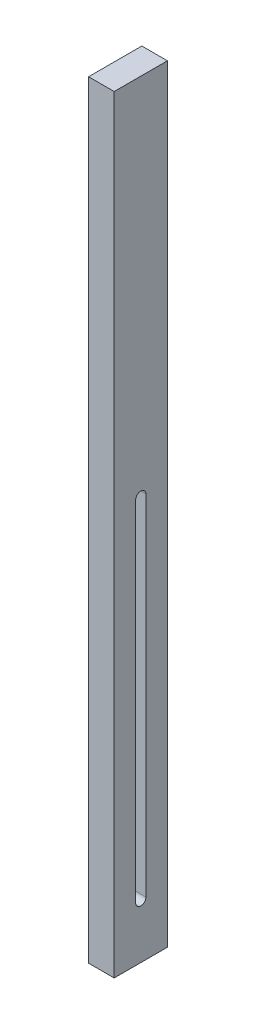
ISO-10303-21;
HEADER;
FILE_DESCRIPTION(('STEP AP214'),'2;1');
FILE_NAME('part.step','',(''),(''),'','','');
FILE_SCHEMA(('AUTOMOTIVE_DESIGN { 1 0 10303 214 1 1 1 1 }'));
ENDSEC;
DATA;
#1=APPLICATION_CONTEXT('core data for automotive mechanical design processes');
#2=APPLICATION_PROTOCOL_DEFINITION('international standard','automotive_design',2000,#1);
#3=PRODUCT_CONTEXT('',#1,'mechanical');
#4=PRODUCT('Part','Part','',(#3));
#5=PRODUCT_RELATED_PRODUCT_CATEGORY('part','',(#4));
#6=PRODUCT_DEFINITION_FORMATION('','',#4);
#7=PRODUCT_DEFINITION_CONTEXT('part definition',#1,'design');
#8=PRODUCT_DEFINITION('design','',#6,#7);
#9=PRODUCT_DEFINITION_SHAPE('','',#8);
#10=(LENGTH_UNIT() NAMED_UNIT(*) SI_UNIT(.MILLI.,.METRE.));
#11=(NAMED_UNIT(*) PLANE_ANGLE_UNIT() SI_UNIT($,.RADIAN.));
#12=(NAMED_UNIT(*) SI_UNIT($,.STERADIAN.) SOLID_ANGLE_UNIT());
#13=UNCERTAINTY_MEASURE_WITH_UNIT(LENGTH_MEASURE(1.E-05),#10,'distance_accuracy_value','');
#14=(GEOMETRIC_REPRESENTATION_CONTEXT(3) GLOBAL_UNCERTAINTY_ASSIGNED_CONTEXT((#13)) GLOBAL_UNIT_ASSIGNED_CONTEXT((#10,
#11,#12)) REPRESENTATION_CONTEXT('',''));
#15=CARTESIAN_POINT('',(0.,0.,0.));
#16=DIRECTION('',(0.,0.,1.));
#17=DIRECTION('',(1.,0.,0.));
#18=AXIS2_PLACEMENT_3D('',#15,#16,#17);
#19=CARTESIAN_POINT('',(-101.237623762376,750.,-21.9059405940594));
#20=DIRECTION('',(1.,0.,0.));
#21=DIRECTION('',(0.,0.,-1.));
#22=AXIS2_PLACEMENT_3D('',#19,#20,#21);
#23=PLANE('',#22);
#24=DIRECTION('',(0.,0.,1.));
#25=VECTOR('',#24,1.);
#26=CARTESIAN_POINT('',(-101.237623762376,0.,-21.9059405940594));
#27=LINE('',#26,#25);
#28=CARTESIAN_POINT('',(-101.237623762376,0.,-21.9059405940594));
#29=VERTEX_POINT('',#28);
#30=CARTESIAN_POINT('',(-101.237623762376,0.,30.0940594059406));
#31=VERTEX_POINT('',#30);
#32=EDGE_CURVE('E130',#29,#31,#27,.T.);
#33=ORIENTED_EDGE('',*,*,#32,.T.);
#34=DIRECTION('',(0.,-1.,0.));
#35=VECTOR('',#34,1.);
#36=CARTESIAN_POINT('',(-101.237623762376,750.,30.0940594059406));
#37=LINE('',#36,#35);
#38=CARTESIAN_POINT('',(-101.237623762376,750.,30.0940594059406));
#39=VERTEX_POINT('',#38);
#40=EDGE_CURVE('E159',#39,#31,#37,.T.);
#41=ORIENTED_EDGE('',*,*,#40,.F.);
#42=DIRECTION('',(0.,0.,1.));
#43=VECTOR('',#42,1.);
#44=CARTESIAN_POINT('',(-101.237623762376,750.,-21.9059405940594));
#45=LINE('',#44,#43);
#46=CARTESIAN_POINT('',(-101.237623762376,750.,-21.9059405940594));
#47=VERTEX_POINT('',#46);
#48=EDGE_CURVE('E133',#47,#39,#45,.T.);
#49=ORIENTED_EDGE('',*,*,#48,.F.);
#50=DIRECTION('',(0.,-1.,0.));
#51=VECTOR('',#50,1.);
#52=CARTESIAN_POINT('',(-101.237623762376,750.,-21.9059405940594));
#53=LINE('',#52,#51);
#54=EDGE_CURVE('E143',#47,#29,#53,.T.);
#55=ORIENTED_EDGE('',*,*,#54,.T.);
#56=EDGE_LOOP('',(#33,#41,#49,#55));
#57=FACE_BOUND('',#56,.T.);
#58=DIRECTION('',(0.,-1.,0.));
#59=VECTOR('',#58,1.);
#60=CARTESIAN_POINT('',(-101.237623762376,0.,9.09405940594056));
#61=LINE('',#60,#59);
#62=CARTESIAN_POINT('',(-101.237623762376,394.,9.09405940594062));
#63=VERTEX_POINT('',#62);
#64=CARTESIAN_POINT('',(-101.237623762376,53.,9.09405940594057));
#65=VERTEX_POINT('',#64);
#66=EDGE_CURVE('E57',#63,#65,#61,.T.);
#67=ORIENTED_EDGE('',*,*,#66,.T.);
#68=CARTESIAN_POINT('',(-101.237623762376,53.,4.09405940594061));
#69=DIRECTION('',(-1.,0.,0.));
#70=DIRECTION('',(0.,0.,1.));
#71=AXIS2_PLACEMENT_3D('',#68,#69,#70);
#72=CIRCLE('',#71,4.99999999999996);
#73=CARTESIAN_POINT('',(-101.237623762376,53.,-0.905940594059353));
#74=VERTEX_POINT('',#73);
#75=EDGE_CURVE('E123',#74,#65,#72,.T.);
#76=ORIENTED_EDGE('',*,*,#75,.F.);
#77=DIRECTION('',(0.,-1.,0.));
#78=VECTOR('',#77,1.);
#79=CARTESIAN_POINT('',(-101.237623762376,0.,-0.905940594059345));
#80=LINE('',#79,#78);
#81=CARTESIAN_POINT('',(-101.237623762376,394.,-0.905940594059405));
#82=VERTEX_POINT('',#81);
#83=EDGE_CURVE('E109',#82,#74,#80,.T.);
#84=ORIENTED_EDGE('',*,*,#83,.F.);
#85=CARTESIAN_POINT('',(-101.237623762376,394.,4.09405940594061));
#86=DIRECTION('',(-1.,0.,0.));
#87=DIRECTION('',(0.,0.,1.));
#88=AXIS2_PLACEMENT_3D('',#85,#86,#87);
#89=CIRCLE('',#88,5.00000000000001);
#90=EDGE_CURVE('E118',#63,#82,#89,.T.);
#91=ORIENTED_EDGE('',*,*,#90,.F.);
#92=EDGE_LOOP('',(#67,#76,#84,#91));
#93=FACE_BOUND('',#92,.T.);
#94=ADVANCED_FACE('F43',(#57,#93),#23,.F.);
#95=CARTESIAN_POINT('',(-76.2376237623762,750.,-21.9059405940594));
#96=DIRECTION('',(-1.,0.,0.));
#97=DIRECTION('',(0.,0.,1.));
#98=AXIS2_PLACEMENT_3D('',#95,#96,#97);
#99=PLANE('',#98);
#100=DIRECTION('',(0.,0.,-1.));
#101=VECTOR('',#100,1.);
#102=CARTESIAN_POINT('',(-76.2376237623762,0.,-21.9059405940594));
#103=LINE('',#102,#101);
#104=CARTESIAN_POINT('',(-76.2376237623762,0.,30.0940594059406));
#105=VERTEX_POINT('',#104);
#106=CARTESIAN_POINT('',(-76.2376237623762,0.,-21.9059405940594));
#107=VERTEX_POINT('',#106);
#108=EDGE_CURVE('E148',#105,#107,#103,.T.);
#109=ORIENTED_EDGE('',*,*,#108,.T.);
#110=DIRECTION('',(0.,-1.,0.));
#111=VECTOR('',#110,1.);
#112=CARTESIAN_POINT('',(-76.2376237623762,750.,-21.9059405940594));
#113=LINE('',#112,#111);
#114=CARTESIAN_POINT('',(-76.2376237623762,750.,-21.9059405940594));
#115=VERTEX_POINT('',#114);
#116=EDGE_CURVE('E153',#115,#107,#113,.T.);
#117=ORIENTED_EDGE('',*,*,#116,.F.);
#118=DIRECTION('',(0.,0.,-1.));
#119=VECTOR('',#118,1.);
#120=CARTESIAN_POINT('',(-76.2376237623762,750.,-21.9059405940594));
#121=LINE('',#120,#119);
#122=CARTESIAN_POINT('',(-76.2376237623762,750.,30.0940594059406));
#123=VERTEX_POINT('',#122);
#124=EDGE_CURVE('E139',#123,#115,#121,.T.);
#125=ORIENTED_EDGE('',*,*,#124,.F.);
#126=DIRECTION('',(0.,-1.,0.));
#127=VECTOR('',#126,1.);
#128=CARTESIAN_POINT('',(-76.2376237623762,750.,30.0940594059406));
#129=LINE('',#128,#127);
#130=EDGE_CURVE('E156',#123,#105,#129,.T.);
#131=ORIENTED_EDGE('',*,*,#130,.T.);
#132=EDGE_LOOP('',(#109,#117,#125,#131));
#133=FACE_BOUND('',#132,.T.);
#134=DIRECTION('',(0.,-1.,0.));
#135=VECTOR('',#134,1.);
#136=CARTESIAN_POINT('',(-76.2376237623762,750.,9.09405940594067));
#137=LINE('',#136,#135);
#138=CARTESIAN_POINT('',(-76.2376237623762,394.,9.09405940594062));
#139=VERTEX_POINT('',#138);
#140=CARTESIAN_POINT('',(-76.2376237623762,53.,9.09405940594057));
#141=VERTEX_POINT('',#140);
#142=EDGE_CURVE('E11',#139,#141,#137,.T.);
#143=ORIENTED_EDGE('',*,*,#142,.F.);
#144=CARTESIAN_POINT('',(-76.2376237623762,394.,4.09405940594061));
#145=DIRECTION('',(-1.,0.,0.));
#146=DIRECTION('',(0.,0.,1.));
#147=AXIS2_PLACEMENT_3D('',#144,#145,#146);
#148=CIRCLE('',#147,5.00000000000001);
#149=CARTESIAN_POINT('',(-76.2376237623762,394.,-0.905940594059405));
#150=VERTEX_POINT('',#149);
#151=EDGE_CURVE('E162',#139,#150,#148,.T.);
#152=ORIENTED_EDGE('',*,*,#151,.T.);
#153=DIRECTION('',(0.,-1.,0.));
#154=VECTOR('',#153,1.);
#155=CARTESIAN_POINT('',(-76.2376237623762,750.,-0.905940594059459));
#156=LINE('',#155,#154);
#157=CARTESIAN_POINT('',(-76.2376237623762,53.,-0.905940594059353));
#158=VERTEX_POINT('',#157);
#159=EDGE_CURVE('E112',#150,#158,#156,.T.);
#160=ORIENTED_EDGE('',*,*,#159,.T.);
#161=CARTESIAN_POINT('',(-76.2376237623762,53.,4.09405940594061));
#162=DIRECTION('',(-1.,0.,0.));
#163=DIRECTION('',(0.,0.,1.));
#164=AXIS2_PLACEMENT_3D('',#161,#162,#163);
#165=CIRCLE('',#164,4.99999999999996);
#166=EDGE_CURVE('E50',#158,#141,#165,.T.);
#167=ORIENTED_EDGE('',*,*,#166,.T.);
#168=EDGE_LOOP('',(#143,#152,#160,#167));
#169=FACE_BOUND('',#168,.T.);
#170=ADVANCED_FACE('F167',(#133,#169),#99,.F.);
#171=CARTESIAN_POINT('',(-101.237623762376,750.,30.0940594059406));
#172=DIRECTION('',(0.,0.,-1.));
#173=DIRECTION('',(-1.,0.,0.));
#174=AXIS2_PLACEMENT_3D('',#171,#172,#173);
#175=PLANE('',#174);
#176=DIRECTION('',(1.,0.,0.));
#177=VECTOR('',#176,1.);
#178=CARTESIAN_POINT('',(-101.237623762376,0.,30.0940594059406));
#179=LINE('',#178,#177);
#180=EDGE_CURVE('E146',#31,#105,#179,.T.);
#181=ORIENTED_EDGE('',*,*,#180,.T.);
#182=ORIENTED_EDGE('',*,*,#130,.F.);
#183=DIRECTION('',(1.,0.,0.));
#184=VECTOR('',#183,1.);
#185=CARTESIAN_POINT('',(-101.237623762376,750.,30.0940594059406));
#186=LINE('',#185,#184);
#187=EDGE_CURVE('E136',#39,#123,#186,.T.);
#188=ORIENTED_EDGE('',*,*,#187,.F.);
#189=ORIENTED_EDGE('',*,*,#40,.T.);
#190=EDGE_LOOP('',(#181,#182,#188,#189));
#191=FACE_BOUND('',#190,.T.);
#192=ADVANCED_FACE('F190',(#191),#175,.F.);
#193=CARTESIAN_POINT('',(-101.237623762376,750.,-21.9059405940594));
#194=DIRECTION('',(0.,0.,1.));
#195=DIRECTION('',(1.,0.,0.));
#196=AXIS2_PLACEMENT_3D('',#193,#194,#195);
#197=PLANE('',#196);
#198=DIRECTION('',(-1.,0.,0.));
#199=VECTOR('',#198,1.);
#200=CARTESIAN_POINT('',(-101.237623762376,0.,-21.9059405940594));
#201=LINE('',#200,#199);
#202=EDGE_CURVE('E137',#107,#29,#201,.T.);
#203=ORIENTED_EDGE('',*,*,#202,.T.);
#204=ORIENTED_EDGE('',*,*,#54,.F.);
#205=DIRECTION('',(-1.,0.,0.));
#206=VECTOR('',#205,1.);
#207=CARTESIAN_POINT('',(-101.237623762376,750.,-21.9059405940594));
#208=LINE('',#207,#206);
#209=EDGE_CURVE('E141',#115,#47,#208,.T.);
#210=ORIENTED_EDGE('',*,*,#209,.F.);
#211=ORIENTED_EDGE('',*,*,#116,.T.);
#212=EDGE_LOOP('',(#203,#204,#210,#211));
#213=FACE_BOUND('',#212,.T.);
#214=ADVANCED_FACE('F206',(#213),#197,.F.);
#215=CARTESIAN_POINT('',(0.,750.,0.));
#216=DIRECTION('',(0.,1.,0.));
#217=DIRECTION('',(0.,0.,1.));
#218=AXIS2_PLACEMENT_3D('',#215,#216,#217);
#219=PLANE('',#218);
#220=ORIENTED_EDGE('',*,*,#48,.T.);
#221=ORIENTED_EDGE('',*,*,#187,.T.);
#222=ORIENTED_EDGE('',*,*,#124,.T.);
#223=ORIENTED_EDGE('',*,*,#209,.T.);
#224=EDGE_LOOP('',(#220,#221,#222,#223));
#225=FACE_BOUND('',#224,.T.);
#226=ADVANCED_FACE('F181',(#225),#219,.T.);
#227=CARTESIAN_POINT('',(0.,0.,0.));
#228=DIRECTION('',(0.,1.,0.));
#229=DIRECTION('',(0.,0.,1.));
#230=AXIS2_PLACEMENT_3D('',#227,#228,#229);
#231=PLANE('',#230);
#232=ORIENTED_EDGE('',*,*,#32,.F.);
#233=ORIENTED_EDGE('',*,*,#202,.F.);
#234=ORIENTED_EDGE('',*,*,#108,.F.);
#235=ORIENTED_EDGE('',*,*,#180,.F.);
#236=EDGE_LOOP('',(#232,#233,#234,#235));
#237=FACE_BOUND('',#236,.T.);
#238=ADVANCED_FACE('F173',(#237),#231,.F.);
#239=CARTESIAN_POINT('',(-61.2376237623762,0.,9.09405940594056));
#240=DIRECTION('',(0.,0.,-1.));
#241=DIRECTION('',(0.,1.,0.));
#242=AXIS2_PLACEMENT_3D('',#239,#240,#241);
#243=PLANE('',#242);
#244=ORIENTED_EDGE('',*,*,#142,.T.);
#245=DIRECTION('',(-1.,0.,0.));
#246=VECTOR('',#245,1.);
#247=CARTESIAN_POINT('',(-61.2376237623762,53.,9.09405940594057));
#248=LINE('',#247,#246);
#249=EDGE_CURVE('E128',#141,#65,#248,.T.);
#250=ORIENTED_EDGE('',*,*,#249,.T.);
#251=ORIENTED_EDGE('',*,*,#66,.F.);
#252=DIRECTION('',(-1.,0.,0.));
#253=VECTOR('',#252,1.);
#254=CARTESIAN_POINT('',(-61.2376237623762,394.,9.09405940594062));
#255=LINE('',#254,#253);
#256=EDGE_CURVE('E115',#139,#63,#255,.T.);
#257=ORIENTED_EDGE('',*,*,#256,.F.);
#258=EDGE_LOOP('',(#244,#250,#251,#257));
#259=FACE_BOUND('',#258,.T.);
#260=ADVANCED_FACE('F171',(#259),#243,.T.);
#261=CARTESIAN_POINT('',(-61.2376237623762,53.,4.09405940594061));
#262=DIRECTION('',(-1.,0.,0.));
#263=DIRECTION('',(0.,0.,1.));
#264=AXIS2_PLACEMENT_3D('',#261,#262,#263);
#265=CYLINDRICAL_SURFACE('',#264,4.99999999999996);
#266=DIRECTION('',(-1.,0.,0.));
#267=VECTOR('',#266,1.);
#268=CARTESIAN_POINT('',(-61.2376237623762,53.,-0.905940594059353));
#269=LINE('',#268,#267);
#270=EDGE_CURVE('E114',#158,#74,#269,.T.);
#271=ORIENTED_EDGE('',*,*,#270,.T.);
#272=ORIENTED_EDGE('',*,*,#75,.T.);
#273=ORIENTED_EDGE('',*,*,#249,.F.);
#274=ORIENTED_EDGE('',*,*,#166,.F.);
#275=EDGE_LOOP('',(#271,#272,#273,#274));
#276=FACE_BOUND('',#275,.T.);
#277=ADVANCED_FACE('F170',(#276),#265,.F.);
#278=CARTESIAN_POINT('',(-61.2376237623762,0.,-0.905940594059345));
#279=DIRECTION('',(0.,0.,-1.));
#280=DIRECTION('',(0.,1.,0.));
#281=AXIS2_PLACEMENT_3D('',#278,#279,#280);
#282=PLANE('',#281);
#283=DIRECTION('',(-1.,0.,0.));
#284=VECTOR('',#283,1.);
#285=CARTESIAN_POINT('',(-61.2376237623762,394.,-0.905940594059405));
#286=LINE('',#285,#284);
#287=EDGE_CURVE('E65',#150,#82,#286,.T.);
#288=ORIENTED_EDGE('',*,*,#287,.T.);
#289=ORIENTED_EDGE('',*,*,#83,.T.);
#290=ORIENTED_EDGE('',*,*,#270,.F.);
#291=ORIENTED_EDGE('',*,*,#159,.F.);
#292=EDGE_LOOP('',(#288,#289,#290,#291));
#293=FACE_BOUND('',#292,.T.);
#294=ADVANCED_FACE('F106',(#293),#282,.F.);
#295=CARTESIAN_POINT('',(-61.2376237623762,394.,4.09405940594061));
#296=DIRECTION('',(-1.,0.,0.));
#297=DIRECTION('',(0.,0.,1.));
#298=AXIS2_PLACEMENT_3D('',#295,#296,#297);
#299=CYLINDRICAL_SURFACE('',#298,5.00000000000001);
#300=ORIENTED_EDGE('',*,*,#256,.T.);
#301=ORIENTED_EDGE('',*,*,#90,.T.);
#302=ORIENTED_EDGE('',*,*,#287,.F.);
#303=ORIENTED_EDGE('',*,*,#151,.F.);
#304=EDGE_LOOP('',(#300,#301,#302,#303));
#305=FACE_BOUND('',#304,.T.);
#306=ADVANCED_FACE('F119',(#305),#299,.F.);
#307=CLOSED_SHELL('',(#94,#170,#192,#214,#226,#238,#260,#277,#294,#306));
#308=MANIFOLD_SOLID_BREP('B2',#307);
#309=ADVANCED_BREP_SHAPE_REPRESENTATION('',(#18,#308),#14);
#310=SHAPE_DEFINITION_REPRESENTATION(#9,#309);
ENDSEC;
END-ISO-10303-21;
